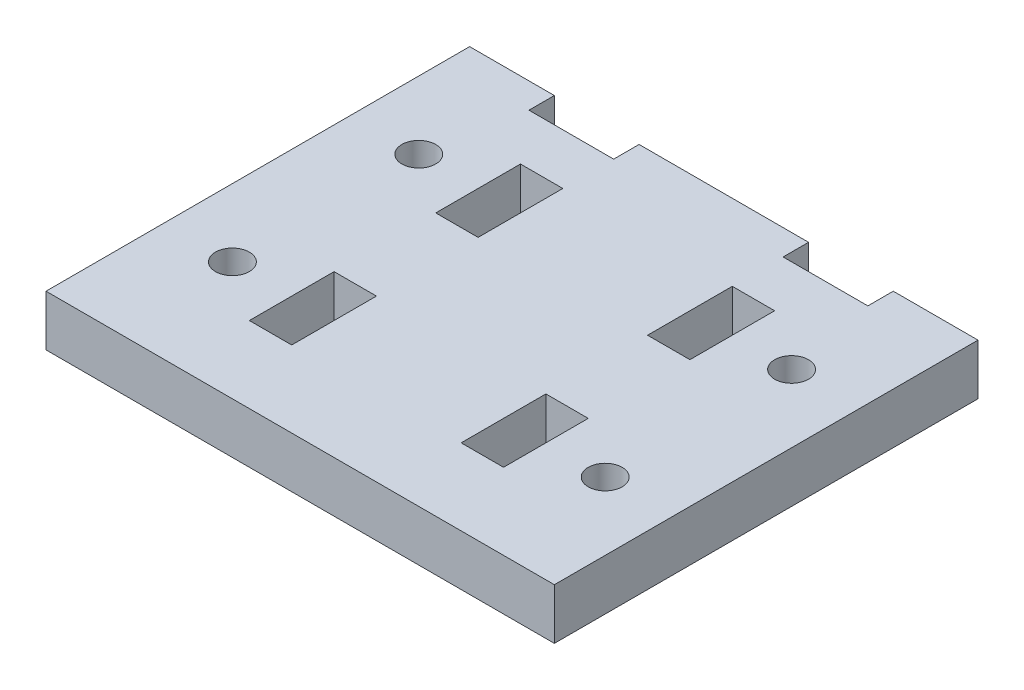
ISO-10303-21;
HEADER;
FILE_DESCRIPTION(('STEP AP214'),'2;1');
FILE_NAME('part.step','',(''),(''),'','','');
FILE_SCHEMA(('AUTOMOTIVE_DESIGN { 1 0 10303 214 1 1 1 1 }'));
ENDSEC;
DATA;
#1=APPLICATION_CONTEXT('core data for automotive mechanical design processes');
#2=APPLICATION_PROTOCOL_DEFINITION('international standard','automotive_design',2000,#1);
#3=PRODUCT_CONTEXT('',#1,'mechanical');
#4=PRODUCT('Part','Part','',(#3));
#5=PRODUCT_RELATED_PRODUCT_CATEGORY('part','',(#4));
#6=PRODUCT_DEFINITION_FORMATION('','',#4);
#7=PRODUCT_DEFINITION_CONTEXT('part definition',#1,'design');
#8=PRODUCT_DEFINITION('design','',#6,#7);
#9=PRODUCT_DEFINITION_SHAPE('','',#8);
#10=(LENGTH_UNIT() NAMED_UNIT(*) SI_UNIT(.MILLI.,.METRE.));
#11=(NAMED_UNIT(*) PLANE_ANGLE_UNIT() SI_UNIT($,.RADIAN.));
#12=(NAMED_UNIT(*) SI_UNIT($,.STERADIAN.) SOLID_ANGLE_UNIT());
#13=UNCERTAINTY_MEASURE_WITH_UNIT(LENGTH_MEASURE(1.E-05),#10,'distance_accuracy_value','');
#14=(GEOMETRIC_REPRESENTATION_CONTEXT(3) GLOBAL_UNCERTAINTY_ASSIGNED_CONTEXT((#13)) GLOBAL_UNIT_ASSIGNED_CONTEXT((#10,
#11,#12)) REPRESENTATION_CONTEXT('',''));
#15=CARTESIAN_POINT('',(0.,0.,0.));
#16=DIRECTION('',(0.,0.,1.));
#17=DIRECTION('',(1.,0.,0.));
#18=AXIS2_PLACEMENT_3D('',#15,#16,#17);
#19=CARTESIAN_POINT('',(0.,6.,0.));
#20=DIRECTION('',(0.,1.,0.));
#21=DIRECTION('',(0.,0.,1.));
#22=AXIS2_PLACEMENT_3D('',#19,#20,#21);
#23=PLANE('',#22);
#24=CARTESIAN_POINT('',(30.3738938253651,6.,-16.8704237831128));
#25=DIRECTION('',(0.,1.,0.));
#26=DIRECTION('',(0.,0.,1.));
#27=AXIS2_PLACEMENT_3D('',#24,#25,#26);
#28=CIRCLE('',#27,2.00000000000001);
#29=CARTESIAN_POINT('',(30.3738938253651,6.,-14.8704237831128));
#30=VERTEX_POINT('',#29);
#31=EDGE_CURVE('E367',#30,#30,#28,.T.);
#32=ORIENTED_EDGE('',*,*,#31,.F.);
#33=EDGE_LOOP('',(#32));
#34=FACE_BOUND('',#33,.T.);
#35=CARTESIAN_POINT('',(-13.6261061746349,6.,-16.8704237831128));
#36=DIRECTION('',(0.,1.,0.));
#37=DIRECTION('',(0.,0.,1.));
#38=AXIS2_PLACEMENT_3D('',#35,#36,#37);
#39=CIRCLE('',#38,2.);
#40=CARTESIAN_POINT('',(-13.6261061746349,6.,-14.8704237831128));
#41=VERTEX_POINT('',#40);
#42=EDGE_CURVE('E426',#41,#41,#39,.T.);
#43=ORIENTED_EDGE('',*,*,#42,.F.);
#44=EDGE_LOOP('',(#43));
#45=FACE_BOUND('',#44,.T.);
#46=DIRECTION('',(0.,0.,1.));
#47=VECTOR('',#46,1.);
#48=CARTESIAN_POINT('',(-21.6261061746349,6.,-30.8704237831128));
#49=LINE('',#48,#47);
#50=CARTESIAN_POINT('',(-21.6261061746349,6.,-30.8704237831128));
#51=VERTEX_POINT('',#50);
#52=CARTESIAN_POINT('',(-21.6261061746349,6.,19.1295762168872));
#53=VERTEX_POINT('',#52);
#54=EDGE_CURVE('E434',#51,#53,#49,.T.);
#55=ORIENTED_EDGE('',*,*,#54,.T.);
#56=DIRECTION('',(1.,0.,0.));
#57=VECTOR('',#56,1.);
#58=CARTESIAN_POINT('',(-21.6261061746349,6.,19.1295762168872));
#59=LINE('',#58,#57);
#60=CARTESIAN_POINT('',(38.3738938253651,6.,19.1295762168872));
#61=VERTEX_POINT('',#60);
#62=EDGE_CURVE('E438',#53,#61,#59,.T.);
#63=ORIENTED_EDGE('',*,*,#62,.T.);
#64=DIRECTION('',(0.,0.,-1.));
#65=VECTOR('',#64,1.);
#66=CARTESIAN_POINT('',(38.3738938253651,6.,-30.8704237831128));
#67=LINE('',#66,#65);
#68=CARTESIAN_POINT('',(38.3738938253651,6.,-30.8704237831128));
#69=VERTEX_POINT('',#68);
#70=EDGE_CURVE('E442',#61,#69,#67,.T.);
#71=ORIENTED_EDGE('',*,*,#70,.T.);
#72=DIRECTION('',(-1.,0.,0.));
#73=VECTOR('',#72,1.);
#74=CARTESIAN_POINT('',(28.3738938253651,6.,-30.8704237831128));
#75=LINE('',#74,#73);
#76=CARTESIAN_POINT('',(28.3738938253651,6.,-30.8704237831128));
#77=VERTEX_POINT('',#76);
#78=EDGE_CURVE('E445',#69,#77,#75,.T.);
#79=ORIENTED_EDGE('',*,*,#78,.T.);
#80=DIRECTION('',(0.,0.,1.));
#81=VECTOR('',#80,1.);
#82=CARTESIAN_POINT('',(28.3738938253651,6.,-27.8704237831128));
#83=LINE('',#82,#81);
#84=CARTESIAN_POINT('',(28.3738938253651,6.,-27.8704237831128));
#85=VERTEX_POINT('',#84);
#86=EDGE_CURVE('E448',#77,#85,#83,.T.);
#87=ORIENTED_EDGE('',*,*,#86,.T.);
#88=DIRECTION('',(-1.,0.,0.));
#89=VECTOR('',#88,1.);
#90=CARTESIAN_POINT('',(18.3738938253651,6.,-27.8704237831128));
#91=LINE('',#90,#89);
#92=CARTESIAN_POINT('',(18.3738938253651,6.,-27.8704237831128));
#93=VERTEX_POINT('',#92);
#94=EDGE_CURVE('E451',#85,#93,#91,.T.);
#95=ORIENTED_EDGE('',*,*,#94,.T.);
#96=DIRECTION('',(0.,0.,-1.));
#97=VECTOR('',#96,1.);
#98=CARTESIAN_POINT('',(18.3738938253651,6.,-27.8704237831128));
#99=LINE('',#98,#97);
#100=CARTESIAN_POINT('',(18.3738938253651,6.,-30.8704237831128));
#101=VERTEX_POINT('',#100);
#102=EDGE_CURVE('E454',#93,#101,#99,.T.);
#103=ORIENTED_EDGE('',*,*,#102,.T.);
#104=DIRECTION('',(-1.,0.,0.));
#105=VECTOR('',#104,1.);
#106=CARTESIAN_POINT('',(-1.62610617463492,6.,-30.8704237831128));
#107=LINE('',#106,#105);
#108=CARTESIAN_POINT('',(-1.62610617463492,6.,-30.8704237831128));
#109=VERTEX_POINT('',#108);
#110=EDGE_CURVE('E457',#101,#109,#107,.T.);
#111=ORIENTED_EDGE('',*,*,#110,.T.);
#112=DIRECTION('',(0.,0.,1.));
#113=VECTOR('',#112,1.);
#114=CARTESIAN_POINT('',(-1.62610617463492,6.,-30.8704237831128));
#115=LINE('',#114,#113);
#116=CARTESIAN_POINT('',(-1.62610617463492,6.,-27.8704237831128));
#117=VERTEX_POINT('',#116);
#118=EDGE_CURVE('E460',#109,#117,#115,.T.);
#119=ORIENTED_EDGE('',*,*,#118,.T.);
#120=DIRECTION('',(-1.,0.,0.));
#121=VECTOR('',#120,1.);
#122=CARTESIAN_POINT('',(-11.6261061746349,6.,-27.8704237831128));
#123=LINE('',#122,#121);
#124=CARTESIAN_POINT('',(-11.6261061746349,6.,-27.8704237831128));
#125=VERTEX_POINT('',#124);
#126=EDGE_CURVE('E463',#117,#125,#123,.T.);
#127=ORIENTED_EDGE('',*,*,#126,.T.);
#128=DIRECTION('',(0.,0.,-1.));
#129=VECTOR('',#128,1.);
#130=CARTESIAN_POINT('',(-11.6261061746349,6.,-30.8704237831128));
#131=LINE('',#130,#129);
#132=CARTESIAN_POINT('',(-11.6261061746349,6.,-30.8704237831128));
#133=VERTEX_POINT('',#132);
#134=EDGE_CURVE('E466',#125,#133,#131,.T.);
#135=ORIENTED_EDGE('',*,*,#134,.T.);
#136=DIRECTION('',(-1.,0.,0.));
#137=VECTOR('',#136,1.);
#138=CARTESIAN_POINT('',(-21.6261061746349,6.,-30.8704237831128));
#139=LINE('',#138,#137);
#140=EDGE_CURVE('E469',#133,#51,#139,.T.);
#141=ORIENTED_EDGE('',*,*,#140,.T.);
#142=EDGE_LOOP('',(#55,#63,#71,#79,#87,#95,#103,#111,#119,#127,#135,#141));
#143=FACE_BOUND('',#142,.T.);
#144=CARTESIAN_POINT('',(-13.6261061746349,6.,5.12957621688716));
#145=DIRECTION('',(0.,1.,0.));
#146=DIRECTION('',(0.,0.,1.));
#147=AXIS2_PLACEMENT_3D('',#144,#145,#146);
#148=CIRCLE('',#147,2.);
#149=CARTESIAN_POINT('',(-13.6261061746349,6.,7.12957621688716));
#150=VERTEX_POINT('',#149);
#151=EDGE_CURVE('E418',#150,#150,#148,.T.);
#152=ORIENTED_EDGE('',*,*,#151,.F.);
#153=EDGE_LOOP('',(#152));
#154=FACE_BOUND('',#153,.T.);
#155=DIRECTION('',(1.,0.,0.));
#156=VECTOR('',#155,1.);
#157=CARTESIAN_POINT('',(18.3738938253651,6.,-11.8704237831128));
#158=LINE('',#157,#156);
#159=CARTESIAN_POINT('',(18.3738938253651,6.,-11.8704237831128));
#160=VERTEX_POINT('',#159);
#161=CARTESIAN_POINT('',(23.3738938253651,6.,-11.8704237831128));
#162=VERTEX_POINT('',#161);
#163=EDGE_CURVE('E378',#160,#162,#158,.T.);
#164=ORIENTED_EDGE('',*,*,#163,.F.);
#165=DIRECTION('',(0.,0.,1.));
#166=VECTOR('',#165,1.);
#167=CARTESIAN_POINT('',(18.3738938253651,6.,-21.8704237831128));
#168=LINE('',#167,#166);
#169=CARTESIAN_POINT('',(18.3738938253651,6.,-21.8704237831128));
#170=VERTEX_POINT('',#169);
#171=EDGE_CURVE('E375',#170,#160,#168,.T.);
#172=ORIENTED_EDGE('',*,*,#171,.F.);
#173=DIRECTION('',(-1.,0.,0.));
#174=VECTOR('',#173,1.);
#175=CARTESIAN_POINT('',(18.3738938253651,6.,-21.8704237831128));
#176=LINE('',#175,#174);
#177=CARTESIAN_POINT('',(23.3738938253651,6.,-21.8704237831128));
#178=VERTEX_POINT('',#177);
#179=EDGE_CURVE('E386',#178,#170,#176,.T.);
#180=ORIENTED_EDGE('',*,*,#179,.F.);
#181=DIRECTION('',(0.,0.,-1.));
#182=VECTOR('',#181,1.);
#183=CARTESIAN_POINT('',(23.3738938253651,6.,-21.8704237831128));
#184=LINE('',#183,#182);
#185=EDGE_CURVE('E382',#162,#178,#184,.T.);
#186=ORIENTED_EDGE('',*,*,#185,.F.);
#187=EDGE_LOOP('',(#164,#172,#180,#186));
#188=FACE_BOUND('',#187,.T.);
#189=CARTESIAN_POINT('',(30.3738938253651,6.,5.12957621688716));
#190=DIRECTION('',(0.,1.,0.));
#191=DIRECTION('',(0.,0.,1.));
#192=AXIS2_PLACEMENT_3D('',#189,#190,#191);
#193=CIRCLE('',#192,2.);
#194=CARTESIAN_POINT('',(30.3738938253651,6.,7.12957621688716));
#195=VERTEX_POINT('',#194);
#196=EDGE_CURVE('E359',#195,#195,#193,.T.);
#197=ORIENTED_EDGE('',*,*,#196,.F.);
#198=EDGE_LOOP('',(#197));
#199=FACE_BOUND('',#198,.T.);
#200=DIRECTION('',(1.,0.,0.));
#201=VECTOR('',#200,1.);
#202=CARTESIAN_POINT('',(-6.62610617463492,6.,-11.8704237831128));
#203=LINE('',#202,#201);
#204=CARTESIAN_POINT('',(-6.62610617463492,6.,-11.8704237831128));
#205=VERTEX_POINT('',#204);
#206=CARTESIAN_POINT('',(-1.62610617463492,6.,-11.8704237831128));
#207=VERTEX_POINT('',#206);
#208=EDGE_CURVE('E319',#205,#207,#203,.T.);
#209=ORIENTED_EDGE('',*,*,#208,.F.);
#210=DIRECTION('',(0.,0.,1.));
#211=VECTOR('',#210,1.);
#212=CARTESIAN_POINT('',(-6.62610617463492,6.,-21.8704237831128));
#213=LINE('',#212,#211);
#214=CARTESIAN_POINT('',(-6.62610617463492,6.,-21.8704237831128));
#215=VERTEX_POINT('',#214);
#216=EDGE_CURVE('E316',#215,#205,#213,.T.);
#217=ORIENTED_EDGE('',*,*,#216,.F.);
#218=DIRECTION('',(-1.,0.,0.));
#219=VECTOR('',#218,1.);
#220=CARTESIAN_POINT('',(-6.62610617463492,6.,-21.8704237831128));
#221=LINE('',#220,#219);
#222=CARTESIAN_POINT('',(-1.62610617463492,6.,-21.8704237831128));
#223=VERTEX_POINT('',#222);
#224=EDGE_CURVE('E327',#223,#215,#221,.T.);
#225=ORIENTED_EDGE('',*,*,#224,.F.);
#226=DIRECTION('',(0.,0.,-1.));
#227=VECTOR('',#226,1.);
#228=CARTESIAN_POINT('',(-1.62610617463492,6.,-21.8704237831128));
#229=LINE('',#228,#227);
#230=EDGE_CURVE('E323',#207,#223,#229,.T.);
#231=ORIENTED_EDGE('',*,*,#230,.F.);
#232=EDGE_LOOP('',(#209,#217,#225,#231));
#233=FACE_BOUND('',#232,.T.);
#234=DIRECTION('',(1.,0.,0.));
#235=VECTOR('',#234,1.);
#236=CARTESIAN_POINT('',(-6.62610617463491,6.,10.1295762168872));
#237=LINE('',#236,#235);
#238=CARTESIAN_POINT('',(-6.62610617463491,6.,10.1295762168872));
#239=VERTEX_POINT('',#238);
#240=CARTESIAN_POINT('',(-1.62610617463491,6.,10.1295762168872));
#241=VERTEX_POINT('',#240);
#242=EDGE_CURVE('E276',#239,#241,#237,.T.);
#243=ORIENTED_EDGE('',*,*,#242,.F.);
#244=DIRECTION('',(0.,0.,1.));
#245=VECTOR('',#244,1.);
#246=CARTESIAN_POINT('',(-6.62610617463492,6.,0.129576216887161));
#247=LINE('',#246,#245);
#248=CARTESIAN_POINT('',(-6.62610617463492,6.,0.129576216887161));
#249=VERTEX_POINT('',#248);
#250=EDGE_CURVE('E273',#249,#239,#247,.T.);
#251=ORIENTED_EDGE('',*,*,#250,.F.);
#252=DIRECTION('',(-1.,0.,0.));
#253=VECTOR('',#252,1.);
#254=CARTESIAN_POINT('',(-6.62610617463492,6.,0.129576216887161));
#255=LINE('',#254,#253);
#256=CARTESIAN_POINT('',(-1.62610617463491,6.,0.129576216887161));
#257=VERTEX_POINT('',#256);
#258=EDGE_CURVE('E284',#257,#249,#255,.T.);
#259=ORIENTED_EDGE('',*,*,#258,.F.);
#260=DIRECTION('',(0.,0.,-1.));
#261=VECTOR('',#260,1.);
#262=CARTESIAN_POINT('',(-1.62610617463491,6.,0.129576216887161));
#263=LINE('',#262,#261);
#264=EDGE_CURVE('E280',#241,#257,#263,.T.);
#265=ORIENTED_EDGE('',*,*,#264,.F.);
#266=EDGE_LOOP('',(#243,#251,#259,#265));
#267=FACE_BOUND('',#266,.T.);
#268=DIRECTION('',(1.,0.,0.));
#269=VECTOR('',#268,1.);
#270=CARTESIAN_POINT('',(18.3738938253651,6.,10.1295762168872));
#271=LINE('',#270,#269);
#272=CARTESIAN_POINT('',(18.3738938253651,6.,10.1295762168872));
#273=VERTEX_POINT('',#272);
#274=CARTESIAN_POINT('',(23.3738938253651,6.,10.1295762168872));
#275=VERTEX_POINT('',#274);
#276=EDGE_CURVE('E234',#273,#275,#271,.T.);
#277=ORIENTED_EDGE('',*,*,#276,.F.);
#278=DIRECTION('',(0.,0.,1.));
#279=VECTOR('',#278,1.);
#280=CARTESIAN_POINT('',(18.3738938253651,6.,0.129576216887161));
#281=LINE('',#280,#279);
#282=CARTESIAN_POINT('',(18.3738938253651,6.,0.129576216887161));
#283=VERTEX_POINT('',#282);
#284=EDGE_CURVE('E225',#283,#273,#281,.T.);
#285=ORIENTED_EDGE('',*,*,#284,.F.);
#286=DIRECTION('',(-1.,0.,0.));
#287=VECTOR('',#286,1.);
#288=CARTESIAN_POINT('',(18.3738938253651,6.,0.129576216887161));
#289=LINE('',#288,#287);
#290=CARTESIAN_POINT('',(23.3738938253651,6.,0.129576216887161));
#291=VERTEX_POINT('',#290);
#292=EDGE_CURVE('E251',#291,#283,#289,.T.);
#293=ORIENTED_EDGE('',*,*,#292,.F.);
#294=DIRECTION('',(0.,0.,-1.));
#295=VECTOR('',#294,1.);
#296=CARTESIAN_POINT('',(23.3738938253651,6.,0.129576216887161));
#297=LINE('',#296,#295);
#298=EDGE_CURVE('E247',#275,#291,#297,.T.);
#299=ORIENTED_EDGE('',*,*,#298,.F.);
#300=EDGE_LOOP('',(#277,#285,#293,#299));
#301=FACE_BOUND('',#300,.T.);
#302=ADVANCED_FACE('F39',(#34,#45,#143,#154,#188,#199,#233,#267,#301),#23,.T.);
#303=CARTESIAN_POINT('',(0.,0.,0.));
#304=DIRECTION('',(0.,1.,0.));
#305=DIRECTION('',(0.,0.,1.));
#306=AXIS2_PLACEMENT_3D('',#303,#304,#305);
#307=PLANE('',#306);
#308=DIRECTION('',(0.,0.,1.));
#309=VECTOR('',#308,1.);
#310=CARTESIAN_POINT('',(-6.62610617463492,0.,0.129576216887161));
#311=LINE('',#310,#309);
#312=CARTESIAN_POINT('',(-6.62610617463492,0.,0.129576216887161));
#313=VERTEX_POINT('',#312);
#314=CARTESIAN_POINT('',(-6.62610617463491,0.,10.1295762168872));
#315=VERTEX_POINT('',#314);
#316=EDGE_CURVE('E243',#313,#315,#311,.T.);
#317=ORIENTED_EDGE('',*,*,#316,.T.);
#318=DIRECTION('',(1.,0.,0.));
#319=VECTOR('',#318,1.);
#320=CARTESIAN_POINT('',(-6.62610617463491,0.,10.1295762168872));
#321=LINE('',#320,#319);
#322=CARTESIAN_POINT('',(-1.62610617463491,0.,10.1295762168872));
#323=VERTEX_POINT('',#322);
#324=EDGE_CURVE('E291',#315,#323,#321,.T.);
#325=ORIENTED_EDGE('',*,*,#324,.T.);
#326=DIRECTION('',(0.,0.,-1.));
#327=VECTOR('',#326,1.);
#328=CARTESIAN_POINT('',(-1.62610617463491,0.,0.129576216887161));
#329=LINE('',#328,#327);
#330=CARTESIAN_POINT('',(-1.62610617463491,0.,0.129576216887161));
#331=VERTEX_POINT('',#330);
#332=EDGE_CURVE('E295',#323,#331,#329,.T.);
#333=ORIENTED_EDGE('',*,*,#332,.T.);
#334=DIRECTION('',(-1.,0.,0.));
#335=VECTOR('',#334,1.);
#336=CARTESIAN_POINT('',(-6.62610617463492,0.,0.129576216887161));
#337=LINE('',#336,#335);
#338=EDGE_CURVE('E277',#331,#313,#337,.T.);
#339=ORIENTED_EDGE('',*,*,#338,.T.);
#340=EDGE_LOOP('',(#317,#325,#333,#339));
#341=FACE_BOUND('',#340,.T.);
#342=CARTESIAN_POINT('',(30.3738938253651,0.,5.12957621688716));
#343=DIRECTION('',(0.,1.,0.));
#344=DIRECTION('',(0.,0.,1.));
#345=AXIS2_PLACEMENT_3D('',#342,#343,#344);
#346=CIRCLE('',#345,2.);
#347=CARTESIAN_POINT('',(30.3738938253651,0.,7.12957621688716));
#348=VERTEX_POINT('',#347);
#349=EDGE_CURVE('E358',#348,#348,#346,.T.);
#350=ORIENTED_EDGE('',*,*,#349,.T.);
#351=EDGE_LOOP('',(#350));
#352=FACE_BOUND('',#351,.T.);
#353=CARTESIAN_POINT('',(30.3738938253651,0.,-16.8704237831128));
#354=DIRECTION('',(0.,1.,0.));
#355=DIRECTION('',(0.,0.,1.));
#356=AXIS2_PLACEMENT_3D('',#353,#354,#355);
#357=CIRCLE('',#356,2.00000000000001);
#358=CARTESIAN_POINT('',(30.3738938253651,0.,-14.8704237831128));
#359=VERTEX_POINT('',#358);
#360=EDGE_CURVE('E363',#359,#359,#357,.T.);
#361=ORIENTED_EDGE('',*,*,#360,.T.);
#362=EDGE_LOOP('',(#361));
#363=FACE_BOUND('',#362,.T.);
#364=DIRECTION('',(0.,0.,1.));
#365=VECTOR('',#364,1.);
#366=CARTESIAN_POINT('',(18.3738938253651,0.,-21.8704237831128));
#367=LINE('',#366,#365);
#368=CARTESIAN_POINT('',(18.3738938253651,0.,-21.8704237831128));
#369=VERTEX_POINT('',#368);
#370=CARTESIAN_POINT('',(18.3738938253651,0.,-11.8704237831128));
#371=VERTEX_POINT('',#370);
#372=EDGE_CURVE('E371',#369,#371,#367,.T.);
#373=ORIENTED_EDGE('',*,*,#372,.T.);
#374=DIRECTION('',(1.,0.,0.));
#375=VECTOR('',#374,1.);
#376=CARTESIAN_POINT('',(18.3738938253651,0.,-11.8704237831128));
#377=LINE('',#376,#375);
#378=CARTESIAN_POINT('',(23.3738938253651,0.,-11.8704237831128));
#379=VERTEX_POINT('',#378);
#380=EDGE_CURVE('E393',#371,#379,#377,.T.);
#381=ORIENTED_EDGE('',*,*,#380,.T.);
#382=DIRECTION('',(0.,0.,-1.));
#383=VECTOR('',#382,1.);
#384=CARTESIAN_POINT('',(23.3738938253651,0.,-21.8704237831128));
#385=LINE('',#384,#383);
#386=CARTESIAN_POINT('',(23.3738938253651,0.,-21.8704237831128));
#387=VERTEX_POINT('',#386);
#388=EDGE_CURVE('E397',#379,#387,#385,.T.);
#389=ORIENTED_EDGE('',*,*,#388,.T.);
#390=DIRECTION('',(-1.,0.,0.));
#391=VECTOR('',#390,1.);
#392=CARTESIAN_POINT('',(18.3738938253651,0.,-21.8704237831128));
#393=LINE('',#392,#391);
#394=EDGE_CURVE('E379',#387,#369,#393,.T.);
#395=ORIENTED_EDGE('',*,*,#394,.T.);
#396=EDGE_LOOP('',(#373,#381,#389,#395));
#397=FACE_BOUND('',#396,.T.);
#398=DIRECTION('',(0.,0.,1.));
#399=VECTOR('',#398,1.);
#400=CARTESIAN_POINT('',(-21.6261061746349,0.,-30.8704237831128));
#401=LINE('',#400,#399);
#402=CARTESIAN_POINT('',(-21.6261061746349,0.,-30.8704237831128));
#403=VERTEX_POINT('',#402);
#404=CARTESIAN_POINT('',(-21.6261061746349,0.,19.1295762168872));
#405=VERTEX_POINT('',#404);
#406=EDGE_CURVE('E430',#403,#405,#401,.T.);
#407=ORIENTED_EDGE('',*,*,#406,.F.);
#408=DIRECTION('',(-1.,0.,0.));
#409=VECTOR('',#408,1.);
#410=CARTESIAN_POINT('',(-21.6261061746349,0.,-30.8704237831128));
#411=LINE('',#410,#409);
#412=CARTESIAN_POINT('',(-11.6261061746349,0.,-30.8704237831128));
#413=VERTEX_POINT('',#412);
#414=EDGE_CURVE('E439',#413,#403,#411,.T.);
#415=ORIENTED_EDGE('',*,*,#414,.F.);
#416=DIRECTION('',(0.,0.,-1.));
#417=VECTOR('',#416,1.);
#418=CARTESIAN_POINT('',(-11.6261061746349,0.,-30.8704237831128));
#419=LINE('',#418,#417);
#420=CARTESIAN_POINT('',(-11.6261061746349,0.,-27.8704237831128));
#421=VERTEX_POINT('',#420);
#422=EDGE_CURVE('E503',#421,#413,#419,.T.);
#423=ORIENTED_EDGE('',*,*,#422,.F.);
#424=DIRECTION('',(-1.,0.,0.));
#425=VECTOR('',#424,1.);
#426=CARTESIAN_POINT('',(-11.6261061746349,0.,-27.8704237831128));
#427=LINE('',#426,#425);
#428=CARTESIAN_POINT('',(-1.62610617463492,0.,-27.8704237831128));
#429=VERTEX_POINT('',#428);
#430=EDGE_CURVE('E500',#429,#421,#427,.T.);
#431=ORIENTED_EDGE('',*,*,#430,.F.);
#432=DIRECTION('',(0.,0.,1.));
#433=VECTOR('',#432,1.);
#434=CARTESIAN_POINT('',(-1.62610617463492,0.,-30.8704237831128));
#435=LINE('',#434,#433);
#436=CARTESIAN_POINT('',(-1.62610617463492,0.,-30.8704237831128));
#437=VERTEX_POINT('',#436);
#438=EDGE_CURVE('E497',#437,#429,#435,.T.);
#439=ORIENTED_EDGE('',*,*,#438,.F.);
#440=DIRECTION('',(-1.,0.,0.));
#441=VECTOR('',#440,1.);
#442=CARTESIAN_POINT('',(-1.62610617463492,0.,-30.8704237831128));
#443=LINE('',#442,#441);
#444=CARTESIAN_POINT('',(18.3738938253651,0.,-30.8704237831128));
#445=VERTEX_POINT('',#444);
#446=EDGE_CURVE('E494',#445,#437,#443,.T.);
#447=ORIENTED_EDGE('',*,*,#446,.F.);
#448=DIRECTION('',(0.,0.,-1.));
#449=VECTOR('',#448,1.);
#450=CARTESIAN_POINT('',(18.3738938253651,0.,-27.8704237831128));
#451=LINE('',#450,#449);
#452=CARTESIAN_POINT('',(18.3738938253651,0.,-27.8704237831128));
#453=VERTEX_POINT('',#452);
#454=EDGE_CURVE('E491',#453,#445,#451,.T.);
#455=ORIENTED_EDGE('',*,*,#454,.F.);
#456=DIRECTION('',(-1.,0.,0.));
#457=VECTOR('',#456,1.);
#458=CARTESIAN_POINT('',(18.3738938253651,0.,-27.8704237831128));
#459=LINE('',#458,#457);
#460=CARTESIAN_POINT('',(28.3738938253651,0.,-27.8704237831128));
#461=VERTEX_POINT('',#460);
#462=EDGE_CURVE('E488',#461,#453,#459,.T.);
#463=ORIENTED_EDGE('',*,*,#462,.F.);
#464=DIRECTION('',(0.,0.,1.));
#465=VECTOR('',#464,1.);
#466=CARTESIAN_POINT('',(28.3738938253651,0.,-27.8704237831128));
#467=LINE('',#466,#465);
#468=CARTESIAN_POINT('',(28.3738938253651,0.,-30.8704237831128));
#469=VERTEX_POINT('',#468);
#470=EDGE_CURVE('E485',#469,#461,#467,.T.);
#471=ORIENTED_EDGE('',*,*,#470,.F.);
#472=DIRECTION('',(-1.,0.,0.));
#473=VECTOR('',#472,1.);
#474=CARTESIAN_POINT('',(28.3738938253651,0.,-30.8704237831128));
#475=LINE('',#474,#473);
#476=CARTESIAN_POINT('',(38.3738938253651,0.,-30.8704237831128));
#477=VERTEX_POINT('',#476);
#478=EDGE_CURVE('E482',#477,#469,#475,.T.);
#479=ORIENTED_EDGE('',*,*,#478,.F.);
#480=DIRECTION('',(0.,0.,-1.));
#481=VECTOR('',#480,1.);
#482=CARTESIAN_POINT('',(38.3738938253651,0.,-30.8704237831128));
#483=LINE('',#482,#481);
#484=CARTESIAN_POINT('',(38.3738938253651,0.,19.1295762168872));
#485=VERTEX_POINT('',#484);
#486=EDGE_CURVE('E479',#485,#477,#483,.T.);
#487=ORIENTED_EDGE('',*,*,#486,.F.);
#488=DIRECTION('',(1.,0.,0.));
#489=VECTOR('',#488,1.);
#490=CARTESIAN_POINT('',(-21.6261061746349,0.,19.1295762168872));
#491=LINE('',#490,#489);
#492=EDGE_CURVE('E476',#405,#485,#491,.T.);
#493=ORIENTED_EDGE('',*,*,#492,.F.);
#494=EDGE_LOOP('',(#407,#415,#423,#431,#439,#447,#455,#463,#471,#479,#487,#493));
#495=FACE_BOUND('',#494,.T.);
#496=CARTESIAN_POINT('',(-13.6261061746349,0.,-16.8704237831128));
#497=DIRECTION('',(0.,1.,0.));
#498=DIRECTION('',(0.,0.,1.));
#499=AXIS2_PLACEMENT_3D('',#496,#497,#498);
#500=CIRCLE('',#499,2.);
#501=CARTESIAN_POINT('',(-13.6261061746349,0.,-14.8704237831128));
#502=VERTEX_POINT('',#501);
#503=EDGE_CURVE('E422',#502,#502,#500,.T.);
#504=ORIENTED_EDGE('',*,*,#503,.T.);
#505=EDGE_LOOP('',(#504));
#506=FACE_BOUND('',#505,.T.);
#507=CARTESIAN_POINT('',(-13.6261061746349,0.,5.12957621688716));
#508=DIRECTION('',(0.,1.,0.));
#509=DIRECTION('',(0.,0.,1.));
#510=AXIS2_PLACEMENT_3D('',#507,#508,#509);
#511=CIRCLE('',#510,2.);
#512=CARTESIAN_POINT('',(-13.6261061746349,0.,7.12957621688716));
#513=VERTEX_POINT('',#512);
#514=EDGE_CURVE('E417',#513,#513,#511,.T.);
#515=ORIENTED_EDGE('',*,*,#514,.T.);
#516=EDGE_LOOP('',(#515));
#517=FACE_BOUND('',#516,.T.);
#518=DIRECTION('',(0.,0.,1.));
#519=VECTOR('',#518,1.);
#520=CARTESIAN_POINT('',(-6.62610617463492,0.,-21.8704237831128));
#521=LINE('',#520,#519);
#522=CARTESIAN_POINT('',(-6.62610617463492,0.,-21.8704237831128));
#523=VERTEX_POINT('',#522);
#524=CARTESIAN_POINT('',(-6.62610617463492,0.,-11.8704237831128));
#525=VERTEX_POINT('',#524);
#526=EDGE_CURVE('E315',#523,#525,#521,.T.);
#527=ORIENTED_EDGE('',*,*,#526,.T.);
#528=DIRECTION('',(1.,0.,0.));
#529=VECTOR('',#528,1.);
#530=CARTESIAN_POINT('',(-6.62610617463492,0.,-11.8704237831128));
#531=LINE('',#530,#529);
#532=CARTESIAN_POINT('',(-1.62610617463492,0.,-11.8704237831128));
#533=VERTEX_POINT('',#532);
#534=EDGE_CURVE('E334',#525,#533,#531,.T.);
#535=ORIENTED_EDGE('',*,*,#534,.T.);
#536=DIRECTION('',(0.,0.,-1.));
#537=VECTOR('',#536,1.);
#538=CARTESIAN_POINT('',(-1.62610617463492,0.,-21.8704237831128));
#539=LINE('',#538,#537);
#540=CARTESIAN_POINT('',(-1.62610617463492,0.,-21.8704237831128));
#541=VERTEX_POINT('',#540);
#542=EDGE_CURVE('E338',#533,#541,#539,.T.);
#543=ORIENTED_EDGE('',*,*,#542,.T.);
#544=DIRECTION('',(-1.,0.,0.));
#545=VECTOR('',#544,1.);
#546=CARTESIAN_POINT('',(-6.62610617463492,0.,-21.8704237831128));
#547=LINE('',#546,#545);
#548=EDGE_CURVE('E320',#541,#523,#547,.T.);
#549=ORIENTED_EDGE('',*,*,#548,.T.);
#550=EDGE_LOOP('',(#527,#535,#543,#549));
#551=FACE_BOUND('',#550,.T.);
#552=DIRECTION('',(0.,0.,1.));
#553=VECTOR('',#552,1.);
#554=CARTESIAN_POINT('',(18.3738938253651,0.,0.129576216887161));
#555=LINE('',#554,#553);
#556=CARTESIAN_POINT('',(18.3738938253651,0.,0.129576216887161));
#557=VERTEX_POINT('',#556);
#558=CARTESIAN_POINT('',(18.3738938253651,0.,10.1295762168872));
#559=VERTEX_POINT('',#558);
#560=EDGE_CURVE('E63',#557,#559,#555,.T.);
#561=ORIENTED_EDGE('',*,*,#560,.T.);
#562=DIRECTION('',(1.,0.,0.));
#563=VECTOR('',#562,1.);
#564=CARTESIAN_POINT('',(18.3738938253651,0.,10.1295762168872));
#565=LINE('',#564,#563);
#566=CARTESIAN_POINT('',(23.3738938253651,0.,10.1295762168872));
#567=VERTEX_POINT('',#566);
#568=EDGE_CURVE('E241',#559,#567,#565,.T.);
#569=ORIENTED_EDGE('',*,*,#568,.T.);
#570=DIRECTION('',(0.,0.,-1.));
#571=VECTOR('',#570,1.);
#572=CARTESIAN_POINT('',(23.3738938253651,0.,0.129576216887161));
#573=LINE('',#572,#571);
#574=CARTESIAN_POINT('',(23.3738938253651,0.,0.129576216887161));
#575=VERTEX_POINT('',#574);
#576=EDGE_CURVE('E260',#567,#575,#573,.T.);
#577=ORIENTED_EDGE('',*,*,#576,.T.);
#578=DIRECTION('',(-1.,0.,0.));
#579=VECTOR('',#578,1.);
#580=CARTESIAN_POINT('',(18.3738938253651,0.,0.129576216887161));
#581=LINE('',#580,#579);
#582=EDGE_CURVE('E235',#575,#557,#581,.T.);
#583=ORIENTED_EDGE('',*,*,#582,.T.);
#584=EDGE_LOOP('',(#561,#569,#577,#583));
#585=FACE_BOUND('',#584,.T.);
#586=ADVANCED_FACE('F558',(#341,#352,#363,#397,#495,#506,#517,#551,#585),#307,.F.);
#587=CARTESIAN_POINT('',(-21.6261061746349,6.,-30.8704237831128));
#588=DIRECTION('',(1.,0.,0.));
#589=DIRECTION('',(0.,0.,-1.));
#590=AXIS2_PLACEMENT_3D('',#587,#588,#589);
#591=PLANE('',#590);
#592=ORIENTED_EDGE('',*,*,#406,.T.);
#593=DIRECTION('',(0.,-1.,0.));
#594=VECTOR('',#593,1.);
#595=CARTESIAN_POINT('',(-21.6261061746349,6.,19.1295762168872));
#596=LINE('',#595,#594);
#597=EDGE_CURVE('E11',#53,#405,#596,.T.);
#598=ORIENTED_EDGE('',*,*,#597,.F.);
#599=ORIENTED_EDGE('',*,*,#54,.F.);
#600=DIRECTION('',(0.,-1.,0.));
#601=VECTOR('',#600,1.);
#602=CARTESIAN_POINT('',(-21.6261061746349,6.,-30.8704237831128));
#603=LINE('',#602,#601);
#604=EDGE_CURVE('E472',#51,#403,#603,.T.);
#605=ORIENTED_EDGE('',*,*,#604,.T.);
#606=EDGE_LOOP('',(#592,#598,#599,#605));
#607=FACE_BOUND('',#606,.T.);
#608=ADVANCED_FACE('F41',(#607),#591,.F.);
#609=CARTESIAN_POINT('',(-21.6261061746349,6.,19.1295762168872));
#610=DIRECTION('',(0.,0.,-1.));
#611=DIRECTION('',(-1.,0.,0.));
#612=AXIS2_PLACEMENT_3D('',#609,#610,#611);
#613=PLANE('',#612);
#614=ORIENTED_EDGE('',*,*,#492,.T.);
#615=DIRECTION('',(0.,-1.,0.));
#616=VECTOR('',#615,1.);
#617=CARTESIAN_POINT('',(38.3738938253651,6.,19.1295762168872));
#618=LINE('',#617,#616);
#619=EDGE_CURVE('E48',#61,#485,#618,.T.);
#620=ORIENTED_EDGE('',*,*,#619,.F.);
#621=ORIENTED_EDGE('',*,*,#62,.F.);
#622=ORIENTED_EDGE('',*,*,#597,.T.);
#623=EDGE_LOOP('',(#614,#620,#621,#622));
#624=FACE_BOUND('',#623,.T.);
#625=ADVANCED_FACE('F576',(#624),#613,.F.);
#626=CARTESIAN_POINT('',(38.3738938253651,6.,-30.8704237831128));
#627=DIRECTION('',(-1.,0.,0.));
#628=DIRECTION('',(0.,0.,1.));
#629=AXIS2_PLACEMENT_3D('',#626,#627,#628);
#630=PLANE('',#629);
#631=ORIENTED_EDGE('',*,*,#486,.T.);
#632=DIRECTION('',(0.,-1.,0.));
#633=VECTOR('',#632,1.);
#634=CARTESIAN_POINT('',(38.3738938253651,6.,-30.8704237831128));
#635=LINE('',#634,#633);
#636=EDGE_CURVE('E543',#69,#477,#635,.T.);
#637=ORIENTED_EDGE('',*,*,#636,.F.);
#638=ORIENTED_EDGE('',*,*,#70,.F.);
#639=ORIENTED_EDGE('',*,*,#619,.T.);
#640=EDGE_LOOP('',(#631,#637,#638,#639));
#641=FACE_BOUND('',#640,.T.);
#642=ADVANCED_FACE('F552',(#641),#630,.F.);
#643=CARTESIAN_POINT('',(28.3738938253651,6.,-30.8704237831128));
#644=DIRECTION('',(0.,0.,1.));
#645=DIRECTION('',(1.,0.,0.));
#646=AXIS2_PLACEMENT_3D('',#643,#644,#645);
#647=PLANE('',#646);
#648=ORIENTED_EDGE('',*,*,#478,.T.);
#649=DIRECTION('',(0.,-1.,0.));
#650=VECTOR('',#649,1.);
#651=CARTESIAN_POINT('',(28.3738938253651,6.,-30.8704237831128));
#652=LINE('',#651,#650);
#653=EDGE_CURVE('E539',#77,#469,#652,.T.);
#654=ORIENTED_EDGE('',*,*,#653,.F.);
#655=ORIENTED_EDGE('',*,*,#78,.F.);
#656=ORIENTED_EDGE('',*,*,#636,.T.);
#657=EDGE_LOOP('',(#648,#654,#655,#656));
#658=FACE_BOUND('',#657,.T.);
#659=ADVANCED_FACE('F564',(#658),#647,.F.);
#660=CARTESIAN_POINT('',(28.3738938253651,6.,-27.8704237831128));
#661=DIRECTION('',(1.,0.,0.));
#662=DIRECTION('',(0.,0.,-1.));
#663=AXIS2_PLACEMENT_3D('',#660,#661,#662);
#664=PLANE('',#663);
#665=ORIENTED_EDGE('',*,*,#470,.T.);
#666=DIRECTION('',(0.,-1.,0.));
#667=VECTOR('',#666,1.);
#668=CARTESIAN_POINT('',(28.3738938253651,6.,-27.8704237831128));
#669=LINE('',#668,#667);
#670=EDGE_CURVE('E535',#85,#461,#669,.T.);
#671=ORIENTED_EDGE('',*,*,#670,.F.);
#672=ORIENTED_EDGE('',*,*,#86,.F.);
#673=ORIENTED_EDGE('',*,*,#653,.T.);
#674=EDGE_LOOP('',(#665,#671,#672,#673));
#675=FACE_BOUND('',#674,.T.);
#676=ADVANCED_FACE('F568',(#675),#664,.F.);
#677=CARTESIAN_POINT('',(18.3738938253651,6.,-27.8704237831128));
#678=DIRECTION('',(0.,0.,1.));
#679=DIRECTION('',(1.,0.,0.));
#680=AXIS2_PLACEMENT_3D('',#677,#678,#679);
#681=PLANE('',#680);
#682=ORIENTED_EDGE('',*,*,#462,.T.);
#683=DIRECTION('',(0.,-1.,0.));
#684=VECTOR('',#683,1.);
#685=CARTESIAN_POINT('',(18.3738938253651,6.,-27.8704237831128));
#686=LINE('',#685,#684);
#687=EDGE_CURVE('E531',#93,#453,#686,.T.);
#688=ORIENTED_EDGE('',*,*,#687,.F.);
#689=ORIENTED_EDGE('',*,*,#94,.F.);
#690=ORIENTED_EDGE('',*,*,#670,.T.);
#691=EDGE_LOOP('',(#682,#688,#689,#690));
#692=FACE_BOUND('',#691,.T.);
#693=ADVANCED_FACE('F609',(#692),#681,.F.);
#694=CARTESIAN_POINT('',(18.3738938253651,6.,-27.8704237831128));
#695=DIRECTION('',(-1.,0.,0.));
#696=DIRECTION('',(0.,0.,1.));
#697=AXIS2_PLACEMENT_3D('',#694,#695,#696);
#698=PLANE('',#697);
#699=ORIENTED_EDGE('',*,*,#454,.T.);
#700=DIRECTION('',(0.,-1.,0.));
#701=VECTOR('',#700,1.);
#702=CARTESIAN_POINT('',(18.3738938253651,6.,-30.8704237831128));
#703=LINE('',#702,#701);
#704=EDGE_CURVE('E527',#101,#445,#703,.T.);
#705=ORIENTED_EDGE('',*,*,#704,.F.);
#706=ORIENTED_EDGE('',*,*,#102,.F.);
#707=ORIENTED_EDGE('',*,*,#687,.T.);
#708=EDGE_LOOP('',(#699,#705,#706,#707));
#709=FACE_BOUND('',#708,.T.);
#710=ADVANCED_FACE('F607',(#709),#698,.F.);
#711=CARTESIAN_POINT('',(-1.62610617463492,6.,-30.8704237831128));
#712=DIRECTION('',(0.,0.,1.));
#713=DIRECTION('',(1.,0.,0.));
#714=AXIS2_PLACEMENT_3D('',#711,#712,#713);
#715=PLANE('',#714);
#716=ORIENTED_EDGE('',*,*,#446,.T.);
#717=DIRECTION('',(0.,-1.,0.));
#718=VECTOR('',#717,1.);
#719=CARTESIAN_POINT('',(-1.62610617463492,6.,-30.8704237831128));
#720=LINE('',#719,#718);
#721=EDGE_CURVE('E523',#109,#437,#720,.T.);
#722=ORIENTED_EDGE('',*,*,#721,.F.);
#723=ORIENTED_EDGE('',*,*,#110,.F.);
#724=ORIENTED_EDGE('',*,*,#704,.T.);
#725=EDGE_LOOP('',(#716,#722,#723,#724));
#726=FACE_BOUND('',#725,.T.);
#727=ADVANCED_FACE('F603',(#726),#715,.F.);
#728=CARTESIAN_POINT('',(-1.62610617463492,6.,-30.8704237831128));
#729=DIRECTION('',(1.,0.,0.));
#730=DIRECTION('',(0.,0.,-1.));
#731=AXIS2_PLACEMENT_3D('',#728,#729,#730);
#732=PLANE('',#731);
#733=ORIENTED_EDGE('',*,*,#438,.T.);
#734=DIRECTION('',(0.,-1.,0.));
#735=VECTOR('',#734,1.);
#736=CARTESIAN_POINT('',(-1.62610617463492,6.,-27.8704237831128));
#737=LINE('',#736,#735);
#738=EDGE_CURVE('E519',#117,#429,#737,.T.);
#739=ORIENTED_EDGE('',*,*,#738,.F.);
#740=ORIENTED_EDGE('',*,*,#118,.F.);
#741=ORIENTED_EDGE('',*,*,#721,.T.);
#742=EDGE_LOOP('',(#733,#739,#740,#741));
#743=FACE_BOUND('',#742,.T.);
#744=ADVANCED_FACE('F598',(#743),#732,.F.);
#745=CARTESIAN_POINT('',(-11.6261061746349,6.,-27.8704237831128));
#746=DIRECTION('',(0.,0.,1.));
#747=DIRECTION('',(1.,0.,0.));
#748=AXIS2_PLACEMENT_3D('',#745,#746,#747);
#749=PLANE('',#748);
#750=ORIENTED_EDGE('',*,*,#430,.T.);
#751=DIRECTION('',(0.,-1.,0.));
#752=VECTOR('',#751,1.);
#753=CARTESIAN_POINT('',(-11.6261061746349,6.,-27.8704237831128));
#754=LINE('',#753,#752);
#755=EDGE_CURVE('E515',#125,#421,#754,.T.);
#756=ORIENTED_EDGE('',*,*,#755,.F.);
#757=ORIENTED_EDGE('',*,*,#126,.F.);
#758=ORIENTED_EDGE('',*,*,#738,.T.);
#759=EDGE_LOOP('',(#750,#756,#757,#758));
#760=FACE_BOUND('',#759,.T.);
#761=ADVANCED_FACE('F592',(#760),#749,.F.);
#762=CARTESIAN_POINT('',(-11.6261061746349,6.,-30.8704237831128));
#763=DIRECTION('',(-1.,0.,0.));
#764=DIRECTION('',(0.,0.,1.));
#765=AXIS2_PLACEMENT_3D('',#762,#763,#764);
#766=PLANE('',#765);
#767=ORIENTED_EDGE('',*,*,#422,.T.);
#768=DIRECTION('',(0.,-1.,0.));
#769=VECTOR('',#768,1.);
#770=CARTESIAN_POINT('',(-11.6261061746349,6.,-30.8704237831128));
#771=LINE('',#770,#769);
#772=EDGE_CURVE('E511',#133,#413,#771,.T.);
#773=ORIENTED_EDGE('',*,*,#772,.F.);
#774=ORIENTED_EDGE('',*,*,#134,.F.);
#775=ORIENTED_EDGE('',*,*,#755,.T.);
#776=EDGE_LOOP('',(#767,#773,#774,#775));
#777=FACE_BOUND('',#776,.T.);
#778=ADVANCED_FACE('F588',(#777),#766,.F.);
#779=CARTESIAN_POINT('',(-21.6261061746349,6.,-30.8704237831128));
#780=DIRECTION('',(0.,0.,1.));
#781=DIRECTION('',(1.,0.,0.));
#782=AXIS2_PLACEMENT_3D('',#779,#780,#781);
#783=PLANE('',#782);
#784=ORIENTED_EDGE('',*,*,#414,.T.);
#785=ORIENTED_EDGE('',*,*,#604,.F.);
#786=ORIENTED_EDGE('',*,*,#140,.F.);
#787=ORIENTED_EDGE('',*,*,#772,.T.);
#788=EDGE_LOOP('',(#784,#785,#786,#787));
#789=FACE_BOUND('',#788,.T.);
#790=ADVANCED_FACE('F583',(#789),#783,.F.);
#791=CARTESIAN_POINT('',(-13.6261061746349,6.,-16.8704237831128));
#792=DIRECTION('',(0.,-1.,0.));
#793=DIRECTION('',(0.,0.,-1.));
#794=AXIS2_PLACEMENT_3D('',#791,#792,#793);
#795=CYLINDRICAL_SURFACE('',#794,2.);
#796=ORIENTED_EDGE('',*,*,#42,.T.);
#797=EDGE_LOOP('',(#796));
#798=FACE_BOUND('',#797,.T.);
#799=ORIENTED_EDGE('',*,*,#503,.F.);
#800=EDGE_LOOP('',(#799));
#801=FACE_BOUND('',#800,.T.);
#802=ADVANCED_FACE('F629',(#798,#801),#795,.F.);
#803=CARTESIAN_POINT('',(-13.6261061746349,6.,5.12957621688716));
#804=DIRECTION('',(0.,-1.,0.));
#805=DIRECTION('',(0.,0.,-1.));
#806=AXIS2_PLACEMENT_3D('',#803,#804,#805);
#807=CYLINDRICAL_SURFACE('',#806,2.);
#808=ORIENTED_EDGE('',*,*,#151,.T.);
#809=EDGE_LOOP('',(#808));
#810=FACE_BOUND('',#809,.T.);
#811=ORIENTED_EDGE('',*,*,#514,.F.);
#812=EDGE_LOOP('',(#811));
#813=FACE_BOUND('',#812,.T.);
#814=ADVANCED_FACE('F667',(#810,#813),#807,.F.);
#815=CARTESIAN_POINT('',(18.3738938253651,6.,-21.8704237831128));
#816=DIRECTION('',(1.,0.,0.));
#817=DIRECTION('',(0.,0.,-1.));
#818=AXIS2_PLACEMENT_3D('',#815,#816,#817);
#819=PLANE('',#818);
#820=ORIENTED_EDGE('',*,*,#372,.F.);
#821=DIRECTION('',(0.,-1.,0.));
#822=VECTOR('',#821,1.);
#823=CARTESIAN_POINT('',(18.3738938253651,6.,-21.8704237831128));
#824=LINE('',#823,#822);
#825=EDGE_CURVE('E389',#170,#369,#824,.T.);
#826=ORIENTED_EDGE('',*,*,#825,.F.);
#827=ORIENTED_EDGE('',*,*,#171,.T.);
#828=DIRECTION('',(0.,-1.,0.));
#829=VECTOR('',#828,1.);
#830=CARTESIAN_POINT('',(18.3738938253651,6.,-11.8704237831128));
#831=LINE('',#830,#829);
#832=EDGE_CURVE('E413',#160,#371,#831,.T.);
#833=ORIENTED_EDGE('',*,*,#832,.T.);
#834=EDGE_LOOP('',(#820,#826,#827,#833));
#835=FACE_BOUND('',#834,.T.);
#836=ADVANCED_FACE('F674',(#835),#819,.T.);
#837=CARTESIAN_POINT('',(18.3738938253651,6.,-11.8704237831128));
#838=DIRECTION('',(0.,0.,-1.));
#839=DIRECTION('',(-1.,0.,0.));
#840=AXIS2_PLACEMENT_3D('',#837,#838,#839);
#841=PLANE('',#840);
#842=ORIENTED_EDGE('',*,*,#380,.F.);
#843=ORIENTED_EDGE('',*,*,#832,.F.);
#844=ORIENTED_EDGE('',*,*,#163,.T.);
#845=DIRECTION('',(0.,-1.,0.));
#846=VECTOR('',#845,1.);
#847=CARTESIAN_POINT('',(23.3738938253651,6.,-11.8704237831128));
#848=LINE('',#847,#846);
#849=EDGE_CURVE('E410',#162,#379,#848,.T.);
#850=ORIENTED_EDGE('',*,*,#849,.T.);
#851=EDGE_LOOP('',(#842,#843,#844,#850));
#852=FACE_BOUND('',#851,.T.);
#853=ADVANCED_FACE('F681',(#852),#841,.T.);
#854=CARTESIAN_POINT('',(23.3738938253651,6.,-21.8704237831128));
#855=DIRECTION('',(-1.,0.,0.));
#856=DIRECTION('',(0.,0.,1.));
#857=AXIS2_PLACEMENT_3D('',#854,#855,#856);
#858=PLANE('',#857);
#859=ORIENTED_EDGE('',*,*,#388,.F.);
#860=ORIENTED_EDGE('',*,*,#849,.F.);
#861=ORIENTED_EDGE('',*,*,#185,.T.);
#862=DIRECTION('',(0.,-1.,0.));
#863=VECTOR('',#862,1.);
#864=CARTESIAN_POINT('',(23.3738938253651,6.,-21.8704237831128));
#865=LINE('',#864,#863);
#866=EDGE_CURVE('E407',#178,#387,#865,.T.);
#867=ORIENTED_EDGE('',*,*,#866,.T.);
#868=EDGE_LOOP('',(#859,#860,#861,#867));
#869=FACE_BOUND('',#868,.T.);
#870=ADVANCED_FACE('F689',(#869),#858,.T.);
#871=CARTESIAN_POINT('',(18.3738938253651,6.,-21.8704237831128));
#872=DIRECTION('',(0.,0.,1.));
#873=DIRECTION('',(1.,0.,0.));
#874=AXIS2_PLACEMENT_3D('',#871,#872,#873);
#875=PLANE('',#874);
#876=ORIENTED_EDGE('',*,*,#394,.F.);
#877=ORIENTED_EDGE('',*,*,#866,.F.);
#878=ORIENTED_EDGE('',*,*,#179,.T.);
#879=ORIENTED_EDGE('',*,*,#825,.T.);
#880=EDGE_LOOP('',(#876,#877,#878,#879));
#881=FACE_BOUND('',#880,.T.);
#882=ADVANCED_FACE('F697',(#881),#875,.T.);
#883=CARTESIAN_POINT('',(30.3738938253651,6.,-16.8704237831128));
#884=DIRECTION('',(0.,-1.,0.));
#885=DIRECTION('',(0.,0.,-1.));
#886=AXIS2_PLACEMENT_3D('',#883,#884,#885);
#887=CYLINDRICAL_SURFACE('',#886,2.00000000000001);
#888=ORIENTED_EDGE('',*,*,#31,.T.);
#889=EDGE_LOOP('',(#888));
#890=FACE_BOUND('',#889,.T.);
#891=ORIENTED_EDGE('',*,*,#360,.F.);
#892=EDGE_LOOP('',(#891));
#893=FACE_BOUND('',#892,.T.);
#894=ADVANCED_FACE('F705',(#890,#893),#887,.F.);
#895=CARTESIAN_POINT('',(30.3738938253651,6.,5.12957621688716));
#896=DIRECTION('',(0.,-1.,0.));
#897=DIRECTION('',(0.,0.,-1.));
#898=AXIS2_PLACEMENT_3D('',#895,#896,#897);
#899=CYLINDRICAL_SURFACE('',#898,2.);
#900=ORIENTED_EDGE('',*,*,#196,.T.);
#901=EDGE_LOOP('',(#900));
#902=FACE_BOUND('',#901,.T.);
#903=ORIENTED_EDGE('',*,*,#349,.F.);
#904=EDGE_LOOP('',(#903));
#905=FACE_BOUND('',#904,.T.);
#906=ADVANCED_FACE('F713',(#902,#905),#899,.F.);
#907=CARTESIAN_POINT('',(-6.62610617463492,6.,-21.8704237831128));
#908=DIRECTION('',(1.,0.,0.));
#909=DIRECTION('',(0.,0.,-1.));
#910=AXIS2_PLACEMENT_3D('',#907,#908,#909);
#911=PLANE('',#910);
#912=ORIENTED_EDGE('',*,*,#526,.F.);
#913=DIRECTION('',(0.,-1.,0.));
#914=VECTOR('',#913,1.);
#915=CARTESIAN_POINT('',(-6.62610617463492,6.,-21.8704237831128));
#916=LINE('',#915,#914);
#917=EDGE_CURVE('E330',#215,#523,#916,.T.);
#918=ORIENTED_EDGE('',*,*,#917,.F.);
#919=ORIENTED_EDGE('',*,*,#216,.T.);
#920=DIRECTION('',(0.,-1.,0.));
#921=VECTOR('',#920,1.);
#922=CARTESIAN_POINT('',(-6.62610617463492,6.,-11.8704237831128));
#923=LINE('',#922,#921);
#924=EDGE_CURVE('E354',#205,#525,#923,.T.);
#925=ORIENTED_EDGE('',*,*,#924,.T.);
#926=EDGE_LOOP('',(#912,#918,#919,#925));
#927=FACE_BOUND('',#926,.T.);
#928=ADVANCED_FACE('F721',(#927),#911,.T.);
#929=CARTESIAN_POINT('',(-6.62610617463492,6.,-11.8704237831128));
#930=DIRECTION('',(0.,0.,-1.));
#931=DIRECTION('',(-1.,0.,0.));
#932=AXIS2_PLACEMENT_3D('',#929,#930,#931);
#933=PLANE('',#932);
#934=ORIENTED_EDGE('',*,*,#534,.F.);
#935=ORIENTED_EDGE('',*,*,#924,.F.);
#936=ORIENTED_EDGE('',*,*,#208,.T.);
#937=DIRECTION('',(0.,-1.,0.));
#938=VECTOR('',#937,1.);
#939=CARTESIAN_POINT('',(-1.62610617463492,6.,-11.8704237831128));
#940=LINE('',#939,#938);
#941=EDGE_CURVE('E351',#207,#533,#940,.T.);
#942=ORIENTED_EDGE('',*,*,#941,.T.);
#943=EDGE_LOOP('',(#934,#935,#936,#942));
#944=FACE_BOUND('',#943,.T.);
#945=ADVANCED_FACE('F729',(#944),#933,.T.);
#946=CARTESIAN_POINT('',(-1.62610617463492,6.,-21.8704237831128));
#947=DIRECTION('',(-1.,0.,0.));
#948=DIRECTION('',(0.,0.,1.));
#949=AXIS2_PLACEMENT_3D('',#946,#947,#948);
#950=PLANE('',#949);
#951=ORIENTED_EDGE('',*,*,#542,.F.);
#952=ORIENTED_EDGE('',*,*,#941,.F.);
#953=ORIENTED_EDGE('',*,*,#230,.T.);
#954=DIRECTION('',(0.,-1.,0.));
#955=VECTOR('',#954,1.);
#956=CARTESIAN_POINT('',(-1.62610617463492,6.,-21.8704237831128));
#957=LINE('',#956,#955);
#958=EDGE_CURVE('E348',#223,#541,#957,.T.);
#959=ORIENTED_EDGE('',*,*,#958,.T.);
#960=EDGE_LOOP('',(#951,#952,#953,#959));
#961=FACE_BOUND('',#960,.T.);
#962=ADVANCED_FACE('F737',(#961),#950,.T.);
#963=CARTESIAN_POINT('',(-6.62610617463492,6.,-21.8704237831128));
#964=DIRECTION('',(0.,0.,1.));
#965=DIRECTION('',(1.,0.,0.));
#966=AXIS2_PLACEMENT_3D('',#963,#964,#965);
#967=PLANE('',#966);
#968=ORIENTED_EDGE('',*,*,#548,.F.);
#969=ORIENTED_EDGE('',*,*,#958,.F.);
#970=ORIENTED_EDGE('',*,*,#224,.T.);
#971=ORIENTED_EDGE('',*,*,#917,.T.);
#972=EDGE_LOOP('',(#968,#969,#970,#971));
#973=FACE_BOUND('',#972,.T.);
#974=ADVANCED_FACE('F745',(#973),#967,.T.);
#975=CARTESIAN_POINT('',(-6.62610617463492,6.,0.129576216887161));
#976=DIRECTION('',(1.,0.,0.));
#977=DIRECTION('',(0.,0.,-1.));
#978=AXIS2_PLACEMENT_3D('',#975,#976,#977);
#979=PLANE('',#978);
#980=ORIENTED_EDGE('',*,*,#316,.F.);
#981=DIRECTION('',(0.,-1.,0.));
#982=VECTOR('',#981,1.);
#983=CARTESIAN_POINT('',(-6.62610617463492,6.,0.129576216887161));
#984=LINE('',#983,#982);
#985=EDGE_CURVE('E287',#249,#313,#984,.T.);
#986=ORIENTED_EDGE('',*,*,#985,.F.);
#987=ORIENTED_EDGE('',*,*,#250,.T.);
#988=DIRECTION('',(0.,-1.,0.));
#989=VECTOR('',#988,1.);
#990=CARTESIAN_POINT('',(-6.62610617463491,6.,10.1295762168872));
#991=LINE('',#990,#989);
#992=EDGE_CURVE('E311',#239,#315,#991,.T.);
#993=ORIENTED_EDGE('',*,*,#992,.T.);
#994=EDGE_LOOP('',(#980,#986,#987,#993));
#995=FACE_BOUND('',#994,.T.);
#996=ADVANCED_FACE('F753',(#995),#979,.T.);
#997=CARTESIAN_POINT('',(-6.62610617463491,6.,10.1295762168872));
#998=DIRECTION('',(0.,0.,-1.));
#999=DIRECTION('',(-1.,0.,0.));
#1000=AXIS2_PLACEMENT_3D('',#997,#998,#999);
#1001=PLANE('',#1000);
#1002=ORIENTED_EDGE('',*,*,#324,.F.);
#1003=ORIENTED_EDGE('',*,*,#992,.F.);
#1004=ORIENTED_EDGE('',*,*,#242,.T.);
#1005=DIRECTION('',(0.,-1.,0.));
#1006=VECTOR('',#1005,1.);
#1007=CARTESIAN_POINT('',(-1.62610617463491,6.,10.1295762168872));
#1008=LINE('',#1007,#1006);
#1009=EDGE_CURVE('E308',#241,#323,#1008,.T.);
#1010=ORIENTED_EDGE('',*,*,#1009,.T.);
#1011=EDGE_LOOP('',(#1002,#1003,#1004,#1010));
#1012=FACE_BOUND('',#1011,.T.);
#1013=ADVANCED_FACE('F761',(#1012),#1001,.T.);
#1014=CARTESIAN_POINT('',(-1.62610617463491,6.,0.129576216887161));
#1015=DIRECTION('',(-1.,0.,0.));
#1016=DIRECTION('',(0.,0.,1.));
#1017=AXIS2_PLACEMENT_3D('',#1014,#1015,#1016);
#1018=PLANE('',#1017);
#1019=ORIENTED_EDGE('',*,*,#332,.F.);
#1020=ORIENTED_EDGE('',*,*,#1009,.F.);
#1021=ORIENTED_EDGE('',*,*,#264,.T.);
#1022=DIRECTION('',(0.,-1.,0.));
#1023=VECTOR('',#1022,1.);
#1024=CARTESIAN_POINT('',(-1.62610617463491,6.,0.129576216887161));
#1025=LINE('',#1024,#1023);
#1026=EDGE_CURVE('E305',#257,#331,#1025,.T.);
#1027=ORIENTED_EDGE('',*,*,#1026,.T.);
#1028=EDGE_LOOP('',(#1019,#1020,#1021,#1027));
#1029=FACE_BOUND('',#1028,.T.);
#1030=ADVANCED_FACE('F769',(#1029),#1018,.T.);
#1031=CARTESIAN_POINT('',(-6.62610617463492,6.,0.129576216887161));
#1032=DIRECTION('',(0.,0.,1.));
#1033=DIRECTION('',(1.,0.,0.));
#1034=AXIS2_PLACEMENT_3D('',#1031,#1032,#1033);
#1035=PLANE('',#1034);
#1036=ORIENTED_EDGE('',*,*,#338,.F.);
#1037=ORIENTED_EDGE('',*,*,#1026,.F.);
#1038=ORIENTED_EDGE('',*,*,#258,.T.);
#1039=ORIENTED_EDGE('',*,*,#985,.T.);
#1040=EDGE_LOOP('',(#1036,#1037,#1038,#1039));
#1041=FACE_BOUND('',#1040,.T.);
#1042=ADVANCED_FACE('F777',(#1041),#1035,.T.);
#1043=CARTESIAN_POINT('',(18.3738938253651,6.,0.129576216887161));
#1044=DIRECTION('',(1.,0.,0.));
#1045=DIRECTION('',(0.,0.,-1.));
#1046=AXIS2_PLACEMENT_3D('',#1043,#1044,#1045);
#1047=PLANE('',#1046);
#1048=ORIENTED_EDGE('',*,*,#560,.F.);
#1049=DIRECTION('',(0.,-1.,0.));
#1050=VECTOR('',#1049,1.);
#1051=CARTESIAN_POINT('',(18.3738938253651,6.,0.129576216887161));
#1052=LINE('',#1051,#1050);
#1053=EDGE_CURVE('E229',#283,#557,#1052,.T.);
#1054=ORIENTED_EDGE('',*,*,#1053,.F.);
#1055=ORIENTED_EDGE('',*,*,#284,.T.);
#1056=DIRECTION('',(0.,-1.,0.));
#1057=VECTOR('',#1056,1.);
#1058=CARTESIAN_POINT('',(18.3738938253651,6.,10.1295762168872));
#1059=LINE('',#1058,#1057);
#1060=EDGE_CURVE('E228',#273,#559,#1059,.T.);
#1061=ORIENTED_EDGE('',*,*,#1060,.T.);
#1062=EDGE_LOOP('',(#1048,#1054,#1055,#1061));
#1063=FACE_BOUND('',#1062,.T.);
#1064=ADVANCED_FACE('F227',(#1063),#1047,.T.);
#1065=CARTESIAN_POINT('',(18.3738938253651,6.,10.1295762168872));
#1066=DIRECTION('',(0.,0.,-1.));
#1067=DIRECTION('',(-1.,0.,0.));
#1068=AXIS2_PLACEMENT_3D('',#1065,#1066,#1067);
#1069=PLANE('',#1068);
#1070=ORIENTED_EDGE('',*,*,#568,.F.);
#1071=ORIENTED_EDGE('',*,*,#1060,.F.);
#1072=ORIENTED_EDGE('',*,*,#276,.T.);
#1073=DIRECTION('',(0.,-1.,0.));
#1074=VECTOR('',#1073,1.);
#1075=CARTESIAN_POINT('',(23.3738938253651,6.,10.1295762168872));
#1076=LINE('',#1075,#1074);
#1077=EDGE_CURVE('E244',#275,#567,#1076,.T.);
#1078=ORIENTED_EDGE('',*,*,#1077,.T.);
#1079=EDGE_LOOP('',(#1070,#1071,#1072,#1078));
#1080=FACE_BOUND('',#1079,.T.);
#1081=ADVANCED_FACE('F238',(#1080),#1069,.T.);
#1082=CARTESIAN_POINT('',(23.3738938253651,6.,0.129576216887161));
#1083=DIRECTION('',(-1.,0.,0.));
#1084=DIRECTION('',(0.,0.,1.));
#1085=AXIS2_PLACEMENT_3D('',#1082,#1083,#1084);
#1086=PLANE('',#1085);
#1087=ORIENTED_EDGE('',*,*,#576,.F.);
#1088=ORIENTED_EDGE('',*,*,#1077,.F.);
#1089=ORIENTED_EDGE('',*,*,#298,.T.);
#1090=DIRECTION('',(0.,-1.,0.));
#1091=VECTOR('',#1090,1.);
#1092=CARTESIAN_POINT('',(23.3738938253651,6.,0.129576216887161));
#1093=LINE('',#1092,#1091);
#1094=EDGE_CURVE('E55',#291,#575,#1093,.T.);
#1095=ORIENTED_EDGE('',*,*,#1094,.T.);
#1096=EDGE_LOOP('',(#1087,#1088,#1089,#1095));
#1097=FACE_BOUND('',#1096,.T.);
#1098=ADVANCED_FACE('F798',(#1097),#1086,.T.);
#1099=CARTESIAN_POINT('',(18.3738938253651,6.,0.129576216887161));
#1100=DIRECTION('',(0.,0.,1.));
#1101=DIRECTION('',(1.,0.,0.));
#1102=AXIS2_PLACEMENT_3D('',#1099,#1100,#1101);
#1103=PLANE('',#1102);
#1104=ORIENTED_EDGE('',*,*,#582,.F.);
#1105=ORIENTED_EDGE('',*,*,#1094,.F.);
#1106=ORIENTED_EDGE('',*,*,#292,.T.);
#1107=ORIENTED_EDGE('',*,*,#1053,.T.);
#1108=EDGE_LOOP('',(#1104,#1105,#1106,#1107));
#1109=FACE_BOUND('',#1108,.T.);
#1110=ADVANCED_FACE('F805',(#1109),#1103,.T.);
#1111=CLOSED_SHELL('',(#302,#586,#608,#625,#642,#659,#676,#693,#710,#727,#744,#761,#778,#790,
#802,#814,#836,#853,#870,#882,#894,#906,#928,#945,#962,#974,#996,#1013,#1030,#1042,#1064,#1081,
#1098,#1110));
#1112=MANIFOLD_SOLID_BREP('B2',#1111);
#1113=ADVANCED_BREP_SHAPE_REPRESENTATION('',(#18,#1112),#14);
#1114=SHAPE_DEFINITION_REPRESENTATION(#9,#1113);
ENDSEC;
END-ISO-10303-21;
